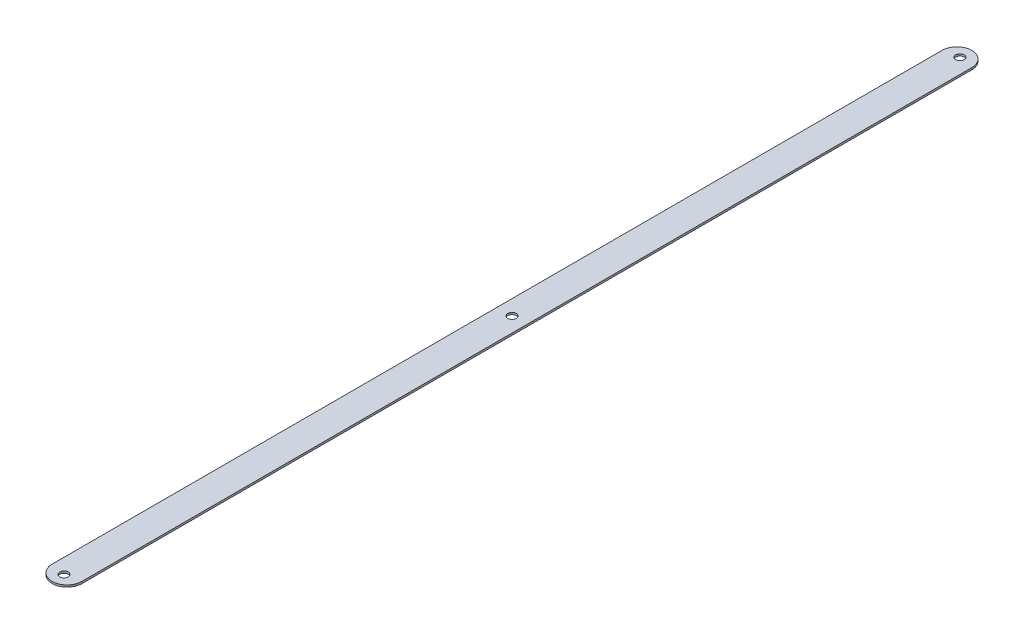
ISO-10303-21;
HEADER;
FILE_DESCRIPTION(('STEP AP214'),'2;1');
FILE_NAME('part.step','',(''),(''),'','','');
FILE_SCHEMA(('AUTOMOTIVE_DESIGN { 1 0 10303 214 1 1 1 1 }'));
ENDSEC;
DATA;
#1=APPLICATION_CONTEXT('core data for automotive mechanical design processes');
#2=APPLICATION_PROTOCOL_DEFINITION('international standard','automotive_design',2000,#1);
#3=PRODUCT_CONTEXT('',#1,'mechanical');
#4=PRODUCT('Part','Part','',(#3));
#5=PRODUCT_RELATED_PRODUCT_CATEGORY('part','',(#4));
#6=PRODUCT_DEFINITION_FORMATION('','',#4);
#7=PRODUCT_DEFINITION_CONTEXT('part definition',#1,'design');
#8=PRODUCT_DEFINITION('design','',#6,#7);
#9=PRODUCT_DEFINITION_SHAPE('','',#8);
#10=(LENGTH_UNIT() NAMED_UNIT(*) SI_UNIT(.MILLI.,.METRE.));
#11=(NAMED_UNIT(*) PLANE_ANGLE_UNIT() SI_UNIT($,.RADIAN.));
#12=(NAMED_UNIT(*) SI_UNIT($,.STERADIAN.) SOLID_ANGLE_UNIT());
#13=UNCERTAINTY_MEASURE_WITH_UNIT(LENGTH_MEASURE(1.E-05),#10,'distance_accuracy_value','');
#14=(GEOMETRIC_REPRESENTATION_CONTEXT(3) GLOBAL_UNCERTAINTY_ASSIGNED_CONTEXT((#13)) GLOBAL_UNIT_ASSIGNED_CONTEXT((#10,
#11,#12)) REPRESENTATION_CONTEXT('',''));
#15=CARTESIAN_POINT('',(0.,0.,0.));
#16=DIRECTION('',(0.,0.,1.));
#17=DIRECTION('',(1.,0.,0.));
#18=AXIS2_PLACEMENT_3D('',#15,#16,#17);
#19=CARTESIAN_POINT('',(0.,1.,-1.5));
#20=DIRECTION('',(0.,-1.,0.));
#21=DIRECTION('',(0.,0.,-1.));
#22=AXIS2_PLACEMENT_3D('',#19,#20,#21);
#23=CYLINDRICAL_SURFACE('',#22,7.5);
#24=CARTESIAN_POINT('',(0.,0.,-1.5));
#25=DIRECTION('',(0.,1.,0.));
#26=DIRECTION('',(0.,0.,1.));
#27=AXIS2_PLACEMENT_3D('',#24,#25,#26);
#28=CIRCLE('',#27,7.5);
#29=CARTESIAN_POINT('',(7.5,0.,-1.5));
#30=VERTEX_POINT('',#29);
#31=CARTESIAN_POINT('',(-7.5,0.,-1.5));
#32=VERTEX_POINT('',#31);
#33=EDGE_CURVE('E108',#30,#32,#28,.F.);
#34=ORIENTED_EDGE('',*,*,#33,.F.);
#35=DIRECTION('',(0.,-1.,0.));
#36=VECTOR('',#35,1.);
#37=CARTESIAN_POINT('',(7.5,1.,-1.5));
#38=LINE('',#37,#36);
#39=CARTESIAN_POINT('',(7.5,1.,-1.5));
#40=VERTEX_POINT('',#39);
#41=EDGE_CURVE('E11',#40,#30,#38,.T.);
#42=ORIENTED_EDGE('',*,*,#41,.F.);
#43=CARTESIAN_POINT('',(0.,1.,-1.5));
#44=DIRECTION('',(0.,1.,0.));
#45=DIRECTION('',(0.,0.,1.));
#46=AXIS2_PLACEMENT_3D('',#43,#44,#45);
#47=CIRCLE('',#46,7.5);
#48=CARTESIAN_POINT('',(-7.5,1.,-1.5));
#49=VERTEX_POINT('',#48);
#50=EDGE_CURVE('E84',#40,#49,#47,.F.);
#51=ORIENTED_EDGE('',*,*,#50,.T.);
#52=DIRECTION('',(0.,-1.,0.));
#53=VECTOR('',#52,1.);
#54=CARTESIAN_POINT('',(-7.5,1.,-1.5));
#55=LINE('',#54,#53);
#56=EDGE_CURVE('E73',#49,#32,#55,.T.);
#57=ORIENTED_EDGE('',*,*,#56,.T.);
#58=EDGE_LOOP('',(#34,#42,#51,#57));
#59=FACE_BOUND('',#58,.T.);
#60=ADVANCED_FACE('F35',(#59),#23,.T.);
#61=CARTESIAN_POINT('',(7.5,1.,0.));
#62=DIRECTION('',(-1.,0.,0.));
#63=DIRECTION('',(0.,0.,1.));
#64=AXIS2_PLACEMENT_3D('',#61,#62,#63);
#65=PLANE('',#64);
#66=DIRECTION('',(0.,0.,-1.));
#67=VECTOR('',#66,1.);
#68=CARTESIAN_POINT('',(7.5,0.,0.));
#69=LINE('',#68,#67);
#70=CARTESIAN_POINT('',(7.5,0.,-449.29));
#71=VERTEX_POINT('',#70);
#72=EDGE_CURVE('E90',#30,#71,#69,.T.);
#73=ORIENTED_EDGE('',*,*,#72,.T.);
#74=DIRECTION('',(0.,-1.,0.));
#75=VECTOR('',#74,1.);
#76=CARTESIAN_POINT('',(7.5,1.,-449.29));
#77=LINE('',#76,#75);
#78=CARTESIAN_POINT('',(7.5,1.,-449.29));
#79=VERTEX_POINT('',#78);
#80=EDGE_CURVE('E43',#79,#71,#77,.T.);
#81=ORIENTED_EDGE('',*,*,#80,.F.);
#82=DIRECTION('',(0.,0.,-1.));
#83=VECTOR('',#82,1.);
#84=CARTESIAN_POINT('',(7.5,1.,0.));
#85=LINE('',#84,#83);
#86=EDGE_CURVE('E78',#40,#79,#85,.T.);
#87=ORIENTED_EDGE('',*,*,#86,.F.);
#88=ORIENTED_EDGE('',*,*,#41,.T.);
#89=EDGE_LOOP('',(#73,#81,#87,#88));
#90=FACE_BOUND('',#89,.T.);
#91=ADVANCED_FACE('F88',(#90),#65,.F.);
#92=CARTESIAN_POINT('',(0.,1.,-449.29));
#93=DIRECTION('',(0.,-1.,0.));
#94=DIRECTION('',(0.,0.,-1.));
#95=AXIS2_PLACEMENT_3D('',#92,#93,#94);
#96=CYLINDRICAL_SURFACE('',#95,7.5);
#97=CARTESIAN_POINT('',(0.,0.,-449.29));
#98=DIRECTION('',(0.,1.,0.));
#99=DIRECTION('',(0.,0.,1.));
#100=AXIS2_PLACEMENT_3D('',#97,#98,#99);
#101=CIRCLE('',#100,7.5);
#102=CARTESIAN_POINT('',(-7.5,0.,-449.29));
#103=VERTEX_POINT('',#102);
#104=EDGE_CURVE('E112',#103,#71,#101,.F.);
#105=ORIENTED_EDGE('',*,*,#104,.F.);
#106=DIRECTION('',(0.,-1.,0.));
#107=VECTOR('',#106,1.);
#108=CARTESIAN_POINT('',(-7.5,1.,-449.29));
#109=LINE('',#108,#107);
#110=CARTESIAN_POINT('',(-7.5,1.,-449.29));
#111=VERTEX_POINT('',#110);
#112=EDGE_CURVE('E66',#111,#103,#109,.T.);
#113=ORIENTED_EDGE('',*,*,#112,.F.);
#114=CARTESIAN_POINT('',(0.,1.,-449.29));
#115=DIRECTION('',(0.,1.,0.));
#116=DIRECTION('',(0.,0.,1.));
#117=AXIS2_PLACEMENT_3D('',#114,#115,#116);
#118=CIRCLE('',#117,7.5);
#119=EDGE_CURVE('E83',#111,#79,#118,.F.);
#120=ORIENTED_EDGE('',*,*,#119,.T.);
#121=ORIENTED_EDGE('',*,*,#80,.T.);
#122=EDGE_LOOP('',(#105,#113,#120,#121));
#123=FACE_BOUND('',#122,.T.);
#124=ADVANCED_FACE('F94',(#123),#96,.T.);
#125=CARTESIAN_POINT('',(0.,1.,-450.79));
#126=DIRECTION('',(0.,-1.,0.));
#127=DIRECTION('',(0.,0.,-1.));
#128=AXIS2_PLACEMENT_3D('',#125,#126,#127);
#129=CYLINDRICAL_SURFACE('',#128,2.15);
#130=CARTESIAN_POINT('',(0.,1.,-450.79));
#131=DIRECTION('',(0.,1.,0.));
#132=DIRECTION('',(0.,0.,1.));
#133=AXIS2_PLACEMENT_3D('',#130,#131,#132);
#134=CIRCLE('',#133,2.15);
#135=CARTESIAN_POINT('',(0.,1.,-448.64));
#136=VERTEX_POINT('',#135);
#137=EDGE_CURVE('E102',#136,#136,#134,.T.);
#138=ORIENTED_EDGE('',*,*,#137,.T.);
#139=EDGE_LOOP('',(#138));
#140=FACE_BOUND('',#139,.T.);
#141=CARTESIAN_POINT('',(0.,0.,-450.79));
#142=DIRECTION('',(0.,1.,0.));
#143=DIRECTION('',(0.,0.,1.));
#144=AXIS2_PLACEMENT_3D('',#141,#142,#143);
#145=CIRCLE('',#144,2.15);
#146=CARTESIAN_POINT('',(0.,0.,-448.64));
#147=VERTEX_POINT('',#146);
#148=EDGE_CURVE('E119',#147,#147,#145,.T.);
#149=ORIENTED_EDGE('',*,*,#148,.F.);
#150=EDGE_LOOP('',(#149));
#151=FACE_BOUND('',#150,.T.);
#152=ADVANCED_FACE('F135',(#140,#151),#129,.F.);
#153=CARTESIAN_POINT('',(0.,1.,-225.395));
#154=DIRECTION('',(0.,-1.,0.));
#155=DIRECTION('',(0.,0.,-1.));
#156=AXIS2_PLACEMENT_3D('',#153,#154,#155);
#157=CYLINDRICAL_SURFACE('',#156,2.15000000000002);
#158=CARTESIAN_POINT('',(0.,1.,-225.395));
#159=DIRECTION('',(0.,1.,0.));
#160=DIRECTION('',(0.,0.,1.));
#161=AXIS2_PLACEMENT_3D('',#158,#159,#160);
#162=CIRCLE('',#161,2.15000000000002);
#163=CARTESIAN_POINT('',(0.,1.,-223.245));
#164=VERTEX_POINT('',#163);
#165=EDGE_CURVE('E96',#164,#164,#162,.T.);
#166=ORIENTED_EDGE('',*,*,#165,.T.);
#167=EDGE_LOOP('',(#166));
#168=FACE_BOUND('',#167,.T.);
#169=CARTESIAN_POINT('',(0.,0.,-225.395));
#170=DIRECTION('',(0.,1.,0.));
#171=DIRECTION('',(0.,0.,1.));
#172=AXIS2_PLACEMENT_3D('',#169,#170,#171);
#173=CIRCLE('',#172,2.15000000000002);
#174=CARTESIAN_POINT('',(0.,0.,-223.245));
#175=VERTEX_POINT('',#174);
#176=EDGE_CURVE('E116',#175,#175,#173,.T.);
#177=ORIENTED_EDGE('',*,*,#176,.F.);
#178=EDGE_LOOP('',(#177));
#179=FACE_BOUND('',#178,.T.);
#180=ADVANCED_FACE('F142',(#168,#179),#157,.F.);
#181=CARTESIAN_POINT('',(-7.5,1.,0.));
#182=DIRECTION('',(1.,0.,0.));
#183=DIRECTION('',(0.,0.,-1.));
#184=AXIS2_PLACEMENT_3D('',#181,#182,#183);
#185=PLANE('',#184);
#186=DIRECTION('',(0.,0.,1.));
#187=VECTOR('',#186,1.);
#188=CARTESIAN_POINT('',(-7.5,0.,0.));
#189=LINE('',#188,#187);
#190=EDGE_CURVE('E114',#103,#32,#189,.T.);
#191=ORIENTED_EDGE('',*,*,#190,.T.);
#192=ORIENTED_EDGE('',*,*,#56,.F.);
#193=DIRECTION('',(0.,0.,1.));
#194=VECTOR('',#193,1.);
#195=CARTESIAN_POINT('',(-7.5,1.,0.));
#196=LINE('',#195,#194);
#197=EDGE_CURVE('E51',#111,#49,#196,.T.);
#198=ORIENTED_EDGE('',*,*,#197,.F.);
#199=ORIENTED_EDGE('',*,*,#112,.T.);
#200=EDGE_LOOP('',(#191,#192,#198,#199));
#201=FACE_BOUND('',#200,.T.);
#202=ADVANCED_FACE('F138',(#201),#185,.F.);
#203=CARTESIAN_POINT('',(0.,1.,0.));
#204=DIRECTION('',(0.,-1.,0.));
#205=DIRECTION('',(0.,0.,-1.));
#206=AXIS2_PLACEMENT_3D('',#203,#204,#205);
#207=CYLINDRICAL_SURFACE('',#206,2.15);
#208=CARTESIAN_POINT('',(0.,1.,0.));
#209=DIRECTION('',(0.,1.,0.));
#210=DIRECTION('',(0.,0.,1.));
#211=AXIS2_PLACEMENT_3D('',#208,#209,#210);
#212=CIRCLE('',#211,2.15);
#213=CARTESIAN_POINT('',(0.,1.,2.15));
#214=VERTEX_POINT('',#213);
#215=EDGE_CURVE('E105',#214,#214,#212,.T.);
#216=ORIENTED_EDGE('',*,*,#215,.T.);
#217=EDGE_LOOP('',(#216));
#218=FACE_BOUND('',#217,.T.);
#219=CARTESIAN_POINT('',(0.,0.,0.));
#220=DIRECTION('',(0.,1.,0.));
#221=DIRECTION('',(0.,0.,1.));
#222=AXIS2_PLACEMENT_3D('',#219,#220,#221);
#223=CIRCLE('',#222,2.15);
#224=CARTESIAN_POINT('',(0.,0.,2.15));
#225=VERTEX_POINT('',#224);
#226=EDGE_CURVE('E122',#225,#225,#223,.T.);
#227=ORIENTED_EDGE('',*,*,#226,.F.);
#228=EDGE_LOOP('',(#227));
#229=FACE_BOUND('',#228,.T.);
#230=ADVANCED_FACE('F141',(#218,#229),#207,.F.);
#231=CARTESIAN_POINT('',(0.,1.,0.));
#232=DIRECTION('',(0.,1.,0.));
#233=DIRECTION('',(0.,0.,1.));
#234=AXIS2_PLACEMENT_3D('',#231,#232,#233);
#235=PLANE('',#234);
#236=ORIENTED_EDGE('',*,*,#50,.F.);
#237=ORIENTED_EDGE('',*,*,#86,.T.);
#238=ORIENTED_EDGE('',*,*,#119,.F.);
#239=ORIENTED_EDGE('',*,*,#197,.T.);
#240=EDGE_LOOP('',(#236,#237,#238,#239));
#241=FACE_BOUND('',#240,.T.);
#242=ORIENTED_EDGE('',*,*,#165,.F.);
#243=EDGE_LOOP('',(#242));
#244=FACE_BOUND('',#243,.T.);
#245=ORIENTED_EDGE('',*,*,#137,.F.);
#246=EDGE_LOOP('',(#245));
#247=FACE_BOUND('',#246,.T.);
#248=ORIENTED_EDGE('',*,*,#215,.F.);
#249=EDGE_LOOP('',(#248));
#250=FACE_BOUND('',#249,.T.);
#251=ADVANCED_FACE('F80',(#241,#244,#247,#250),#235,.T.);
#252=CARTESIAN_POINT('',(0.,0.,0.));
#253=DIRECTION('',(0.,1.,0.));
#254=DIRECTION('',(0.,0.,1.));
#255=AXIS2_PLACEMENT_3D('',#252,#253,#254);
#256=PLANE('',#255);
#257=ORIENTED_EDGE('',*,*,#33,.T.);
#258=ORIENTED_EDGE('',*,*,#190,.F.);
#259=ORIENTED_EDGE('',*,*,#104,.T.);
#260=ORIENTED_EDGE('',*,*,#72,.F.);
#261=EDGE_LOOP('',(#257,#258,#259,#260));
#262=FACE_BOUND('',#261,.T.);
#263=ORIENTED_EDGE('',*,*,#176,.T.);
#264=EDGE_LOOP('',(#263));
#265=FACE_BOUND('',#264,.T.);
#266=ORIENTED_EDGE('',*,*,#148,.T.);
#267=EDGE_LOOP('',(#266));
#268=FACE_BOUND('',#267,.T.);
#269=ORIENTED_EDGE('',*,*,#226,.T.);
#270=EDGE_LOOP('',(#269));
#271=FACE_BOUND('',#270,.T.);
#272=ADVANCED_FACE('F152',(#262,#265,#268,#271),#256,.F.);
#273=CLOSED_SHELL('',(#60,#91,#124,#152,#180,#202,#230,#251,#272));
#274=MANIFOLD_SOLID_BREP('B2',#273);
#275=ADVANCED_BREP_SHAPE_REPRESENTATION('',(#18,#274),#14);
#276=SHAPE_DEFINITION_REPRESENTATION(#9,#275);
ENDSEC;
END-ISO-10303-21;
